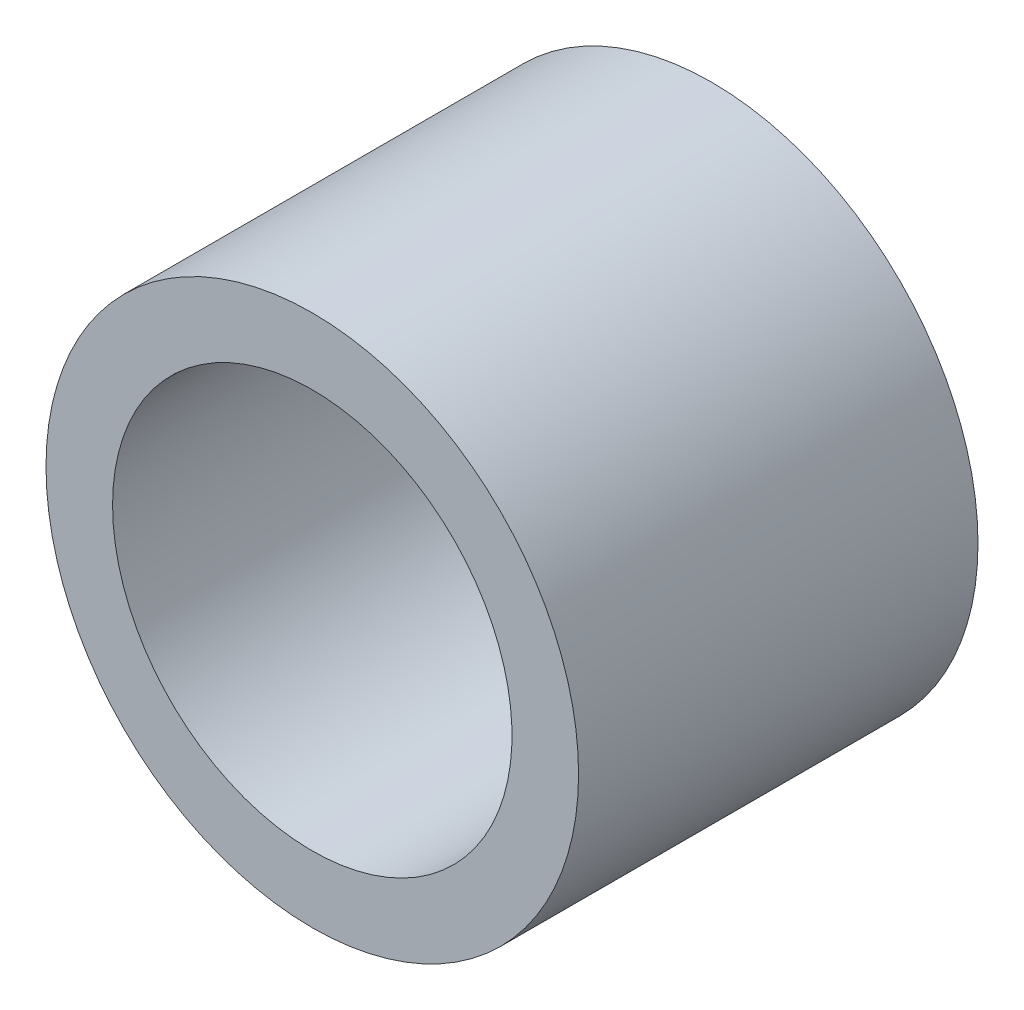
ISO-10303-21;
HEADER;
FILE_DESCRIPTION(('STEP AP214'),'2;1');
FILE_NAME('part.step','',(''),(''),'','','');
FILE_SCHEMA(('AUTOMOTIVE_DESIGN { 1 0 10303 214 1 1 1 1 }'));
ENDSEC;
DATA;
#1=APPLICATION_CONTEXT('core data for automotive mechanical design processes');
#2=APPLICATION_PROTOCOL_DEFINITION('international standard','automotive_design',2000,#1);
#3=PRODUCT_CONTEXT('',#1,'mechanical');
#4=PRODUCT('Part','Part','',(#3));
#5=PRODUCT_RELATED_PRODUCT_CATEGORY('part','',(#4));
#6=PRODUCT_DEFINITION_FORMATION('','',#4);
#7=PRODUCT_DEFINITION_CONTEXT('part definition',#1,'design');
#8=PRODUCT_DEFINITION('design','',#6,#7);
#9=PRODUCT_DEFINITION_SHAPE('','',#8);
#10=(LENGTH_UNIT() NAMED_UNIT(*) SI_UNIT(.MILLI.,.METRE.));
#11=(NAMED_UNIT(*) PLANE_ANGLE_UNIT() SI_UNIT($,.RADIAN.));
#12=(NAMED_UNIT(*) SI_UNIT($,.STERADIAN.) SOLID_ANGLE_UNIT());
#13=UNCERTAINTY_MEASURE_WITH_UNIT(LENGTH_MEASURE(1.E-05),#10,'distance_accuracy_value','');
#14=(GEOMETRIC_REPRESENTATION_CONTEXT(3) GLOBAL_UNCERTAINTY_ASSIGNED_CONTEXT((#13)) GLOBAL_UNIT_ASSIGNED_CONTEXT((#10,
#11,#12)) REPRESENTATION_CONTEXT('',''));
#15=CARTESIAN_POINT('',(0.,0.,0.));
#16=DIRECTION('',(0.,0.,1.));
#17=DIRECTION('',(1.,0.,0.));
#18=AXIS2_PLACEMENT_3D('',#15,#16,#17);
#19=CARTESIAN_POINT('',(0.,0.,19.05));
#20=DIRECTION('',(0.,0.,1.));
#21=DIRECTION('',(1.,0.,0.));
#22=AXIS2_PLACEMENT_3D('',#19,#20,#21);
#23=PLANE('',#22);
#24=CARTESIAN_POINT('',(0.,0.,19.05));
#25=DIRECTION('',(0.,0.,1.));
#26=DIRECTION('',(1.,0.,0.));
#27=AXIS2_PLACEMENT_3D('',#24,#25,#26);
#28=CIRCLE('',#27,12.7);
#29=CARTESIAN_POINT('',(-12.7,0.,19.05));
#30=VERTEX_POINT('',#29);
#31=EDGE_CURVE('E10',#30,#30,#28,.T.);
#32=ORIENTED_EDGE('',*,*,#31,.T.);
#33=EDGE_LOOP('',(#32));
#34=FACE_BOUND('',#33,.T.);
#35=CARTESIAN_POINT('',(0.,0.,19.05));
#36=DIRECTION('',(0.,0.,1.));
#37=DIRECTION('',(1.,0.,0.));
#38=AXIS2_PLACEMENT_3D('',#35,#36,#37);
#39=CIRCLE('',#38,9.525);
#40=CARTESIAN_POINT('',(-9.525,0.,19.05));
#41=VERTEX_POINT('',#40);
#42=EDGE_CURVE('E43',#41,#41,#39,.T.);
#43=ORIENTED_EDGE('',*,*,#42,.F.);
#44=EDGE_LOOP('',(#43));
#45=FACE_BOUND('',#44,.T.);
#46=ADVANCED_FACE('F32',(#34,#45),#23,.T.);
#47=CARTESIAN_POINT('',(0.,0.,0.));
#48=DIRECTION('',(0.,0.,1.));
#49=DIRECTION('',(1.,0.,0.));
#50=AXIS2_PLACEMENT_3D('',#47,#48,#49);
#51=PLANE('',#50);
#52=CARTESIAN_POINT('',(0.,0.,0.));
#53=DIRECTION('',(0.,0.,1.));
#54=DIRECTION('',(1.,0.,0.));
#55=AXIS2_PLACEMENT_3D('',#52,#53,#54);
#56=CIRCLE('',#55,12.7);
#57=CARTESIAN_POINT('',(-12.7,0.,0.));
#58=VERTEX_POINT('',#57);
#59=EDGE_CURVE('E36',#58,#58,#56,.T.);
#60=ORIENTED_EDGE('',*,*,#59,.F.);
#61=EDGE_LOOP('',(#60));
#62=FACE_BOUND('',#61,.T.);
#63=CARTESIAN_POINT('',(0.,0.,0.));
#64=DIRECTION('',(0.,0.,1.));
#65=DIRECTION('',(1.,0.,0.));
#66=AXIS2_PLACEMENT_3D('',#63,#64,#65);
#67=CIRCLE('',#66,9.525);
#68=CARTESIAN_POINT('',(-9.525,0.,0.));
#69=VERTEX_POINT('',#68);
#70=EDGE_CURVE('E45',#69,#69,#67,.T.);
#71=ORIENTED_EDGE('',*,*,#70,.T.);
#72=EDGE_LOOP('',(#71));
#73=FACE_BOUND('',#72,.T.);
#74=ADVANCED_FACE('F55',(#62,#73),#51,.F.);
#75=CARTESIAN_POINT('',(0.,0.,19.05));
#76=DIRECTION('',(0.,0.,-1.));
#77=DIRECTION('',(-1.,0.,0.));
#78=AXIS2_PLACEMENT_3D('',#75,#76,#77);
#79=CYLINDRICAL_SURFACE('',#78,12.7);
#80=CARTESIAN_POINT('',(-12.7,0.,19.05));
#81=CARTESIAN_POINT('',(-12.7,0.,18.8515625));
#82=CARTESIAN_POINT('',(-12.7,0.,18.653125));
#83=CARTESIAN_POINT('',(-12.7,0.,18.25625));
#84=CARTESIAN_POINT('',(-12.7,0.,18.0578125));
#85=CARTESIAN_POINT('',(-12.7,0.,17.6609375));
#86=CARTESIAN_POINT('',(-12.7,0.,17.4625));
#87=CARTESIAN_POINT('',(-12.7,0.,17.065625));
#88=CARTESIAN_POINT('',(-12.7,0.,16.8671875));
#89=CARTESIAN_POINT('',(-12.7,0.,16.4703125));
#90=CARTESIAN_POINT('',(-12.7,0.,16.271875));
#91=CARTESIAN_POINT('',(-12.7,0.,15.875));
#92=CARTESIAN_POINT('',(-12.7,0.,15.6765625));
#93=CARTESIAN_POINT('',(-12.7,0.,15.2796875));
#94=CARTESIAN_POINT('',(-12.7,0.,15.08125));
#95=CARTESIAN_POINT('',(-12.7,0.,14.684375));
#96=CARTESIAN_POINT('',(-12.7,0.,14.4859375));
#97=CARTESIAN_POINT('',(-12.7,0.,14.0890625));
#98=CARTESIAN_POINT('',(-12.7,0.,13.890625));
#99=CARTESIAN_POINT('',(-12.7,0.,13.49375));
#100=CARTESIAN_POINT('',(-12.7,0.,13.2953125));
#101=CARTESIAN_POINT('',(-12.7,0.,12.8984375));
#102=CARTESIAN_POINT('',(-12.7,0.,12.7));
#103=CARTESIAN_POINT('',(-12.7,0.,12.303125));
#104=CARTESIAN_POINT('',(-12.7,0.,12.1046875));
#105=CARTESIAN_POINT('',(-12.7,0.,11.7078125));
#106=CARTESIAN_POINT('',(-12.7,0.,11.509375));
#107=CARTESIAN_POINT('',(-12.7,0.,11.1125));
#108=CARTESIAN_POINT('',(-12.7,0.,10.9140625));
#109=CARTESIAN_POINT('',(-12.7,0.,10.5171875));
#110=CARTESIAN_POINT('',(-12.7,0.,10.31875));
#111=CARTESIAN_POINT('',(-12.7,0.,9.921875));
#112=CARTESIAN_POINT('',(-12.7,0.,9.7234375));
#113=CARTESIAN_POINT('',(-12.7,0.,9.3265625));
#114=CARTESIAN_POINT('',(-12.7,0.,9.128125));
#115=CARTESIAN_POINT('',(-12.7,0.,8.73125));
#116=CARTESIAN_POINT('',(-12.7,0.,8.5328125));
#117=CARTESIAN_POINT('',(-12.7,0.,8.1359375));
#118=CARTESIAN_POINT('',(-12.7,0.,7.9375));
#119=CARTESIAN_POINT('',(-12.7,0.,7.540625));
#120=CARTESIAN_POINT('',(-12.7,0.,7.3421875));
#121=CARTESIAN_POINT('',(-12.7,0.,6.9453125));
#122=CARTESIAN_POINT('',(-12.7,0.,6.746875));
#123=CARTESIAN_POINT('',(-12.7,0.,6.35));
#124=CARTESIAN_POINT('',(-12.7,0.,6.1515625));
#125=CARTESIAN_POINT('',(-12.7,0.,5.7546875));
#126=CARTESIAN_POINT('',(-12.7,0.,5.55625));
#127=CARTESIAN_POINT('',(-12.7,0.,5.159375));
#128=CARTESIAN_POINT('',(-12.7,0.,4.9609375));
#129=CARTESIAN_POINT('',(-12.7,0.,4.5640625));
#130=CARTESIAN_POINT('',(-12.7,0.,4.365625));
#131=CARTESIAN_POINT('',(-12.7,0.,3.96875));
#132=CARTESIAN_POINT('',(-12.7,0.,3.7703125));
#133=CARTESIAN_POINT('',(-12.7,0.,3.3734375));
#134=CARTESIAN_POINT('',(-12.7,0.,3.175));
#135=CARTESIAN_POINT('',(-12.7,0.,2.778125));
#136=CARTESIAN_POINT('',(-12.7,0.,2.5796875));
#137=CARTESIAN_POINT('',(-12.7,0.,2.1828125));
#138=CARTESIAN_POINT('',(-12.7,0.,1.984375));
#139=CARTESIAN_POINT('',(-12.7,0.,1.5875));
#140=CARTESIAN_POINT('',(-12.7,0.,1.3890625));
#141=CARTESIAN_POINT('',(-12.7,0.,0.992187500000001));
#142=CARTESIAN_POINT('',(-12.7,0.,0.793750000000001));
#143=CARTESIAN_POINT('',(-12.7,0.,0.396875));
#144=CARTESIAN_POINT('',(-12.7,0.,0.1984375));
#145=CARTESIAN_POINT('',(-12.7,0.,0.));
#146=B_SPLINE_CURVE_WITH_KNOTS('',3,(#80,#81,#82,#83,#84,#85,#86,#87,#88,#89,#90,#91,#92,#93,
#94,#95,#96,#97,#98,#99,#100,#101,#102,#103,#104,#105,#106,#107,#108,#109,#110,#111,#112,#113,
#114,#115,#116,#117,#118,#119,#120,#121,#122,#123,#124,#125,#126,#127,#128,#129,#130,#131,#132,
#133,#134,#135,#136,#137,#138,#139,#140,#141,#142,#143,#144,#145),.UNSPECIFIED.,.F.,.F.,(4,2,2,
2,2,2,2,2,2,2,2,2,2,2,2,2,2,2,2,2,2,2,2,2,2,2,2,2,2,2,2,2,4),(0.,0.595312499999997,1.190625,
1.7859375,2.38125,2.9765625,3.571875,4.1671875,4.7625,5.3578125,5.953125,6.5484375,7.14375,
7.7390625,8.334375,8.9296875,9.525,10.1203125,10.715625,11.3109375,11.90625,12.5015625,
13.096875,13.6921875,14.2875,14.8828125,15.478125,16.0734375,16.66875,17.2640625,17.859375,
18.4546875,19.05),.UNSPECIFIED.);
#147=EDGE_CURVE('BSEAM34',#30,#58,#146,.T.);
#148=ORIENTED_EDGE('',*,*,#31,.F.);
#149=ORIENTED_EDGE('',*,*,#59,.T.);
#150=ORIENTED_EDGE('',*,*,#147,.T.);
#151=ORIENTED_EDGE('',*,*,#147,.F.);
#152=EDGE_LOOP('',(#148,#150,#149,#151));
#153=FACE_BOUND('',#152,.T.);
#154=ADVANCED_FACE('F34',(#153),#79,.T.);
#155=CARTESIAN_POINT('',(0.,0.,19.05));
#156=DIRECTION('',(0.,0.,-1.));
#157=DIRECTION('',(-1.,0.,0.));
#158=AXIS2_PLACEMENT_3D('',#155,#156,#157);
#159=CYLINDRICAL_SURFACE('',#158,9.525);
#160=CARTESIAN_POINT('',(-9.525,0.,19.05));
#161=CARTESIAN_POINT('',(-9.525,0.,18.8515625));
#162=CARTESIAN_POINT('',(-9.525,0.,18.653125));
#163=CARTESIAN_POINT('',(-9.525,0.,18.25625));
#164=CARTESIAN_POINT('',(-9.525,0.,18.0578125));
#165=CARTESIAN_POINT('',(-9.525,0.,17.6609375));
#166=CARTESIAN_POINT('',(-9.525,0.,17.4625));
#167=CARTESIAN_POINT('',(-9.525,0.,17.065625));
#168=CARTESIAN_POINT('',(-9.525,0.,16.8671875));
#169=CARTESIAN_POINT('',(-9.525,0.,16.4703125));
#170=CARTESIAN_POINT('',(-9.525,0.,16.271875));
#171=CARTESIAN_POINT('',(-9.525,0.,15.875));
#172=CARTESIAN_POINT('',(-9.525,0.,15.6765625));
#173=CARTESIAN_POINT('',(-9.525,0.,15.2796875));
#174=CARTESIAN_POINT('',(-9.525,0.,15.08125));
#175=CARTESIAN_POINT('',(-9.525,0.,14.684375));
#176=CARTESIAN_POINT('',(-9.525,0.,14.4859375));
#177=CARTESIAN_POINT('',(-9.525,0.,14.0890625));
#178=CARTESIAN_POINT('',(-9.525,0.,13.890625));
#179=CARTESIAN_POINT('',(-9.525,0.,13.49375));
#180=CARTESIAN_POINT('',(-9.525,0.,13.2953125));
#181=CARTESIAN_POINT('',(-9.525,0.,12.8984375));
#182=CARTESIAN_POINT('',(-9.525,0.,12.7));
#183=CARTESIAN_POINT('',(-9.525,0.,12.303125));
#184=CARTESIAN_POINT('',(-9.525,0.,12.1046875));
#185=CARTESIAN_POINT('',(-9.525,0.,11.7078125));
#186=CARTESIAN_POINT('',(-9.525,0.,11.509375));
#187=CARTESIAN_POINT('',(-9.525,0.,11.1125));
#188=CARTESIAN_POINT('',(-9.525,0.,10.9140625));
#189=CARTESIAN_POINT('',(-9.525,0.,10.5171875));
#190=CARTESIAN_POINT('',(-9.525,0.,10.31875));
#191=CARTESIAN_POINT('',(-9.525,0.,9.921875));
#192=CARTESIAN_POINT('',(-9.525,0.,9.7234375));
#193=CARTESIAN_POINT('',(-9.525,0.,9.3265625));
#194=CARTESIAN_POINT('',(-9.525,0.,9.128125));
#195=CARTESIAN_POINT('',(-9.525,0.,8.73125));
#196=CARTESIAN_POINT('',(-9.525,0.,8.5328125));
#197=CARTESIAN_POINT('',(-9.525,0.,8.1359375));
#198=CARTESIAN_POINT('',(-9.525,0.,7.9375));
#199=CARTESIAN_POINT('',(-9.525,0.,7.540625));
#200=CARTESIAN_POINT('',(-9.525,0.,7.3421875));
#201=CARTESIAN_POINT('',(-9.525,0.,6.9453125));
#202=CARTESIAN_POINT('',(-9.525,0.,6.746875));
#203=CARTESIAN_POINT('',(-9.525,0.,6.35));
#204=CARTESIAN_POINT('',(-9.525,0.,6.1515625));
#205=CARTESIAN_POINT('',(-9.525,0.,5.7546875));
#206=CARTESIAN_POINT('',(-9.525,0.,5.55625));
#207=CARTESIAN_POINT('',(-9.525,0.,5.159375));
#208=CARTESIAN_POINT('',(-9.525,0.,4.9609375));
#209=CARTESIAN_POINT('',(-9.525,0.,4.5640625));
#210=CARTESIAN_POINT('',(-9.525,0.,4.365625));
#211=CARTESIAN_POINT('',(-9.525,0.,3.96875));
#212=CARTESIAN_POINT('',(-9.525,0.,3.7703125));
#213=CARTESIAN_POINT('',(-9.525,0.,3.3734375));
#214=CARTESIAN_POINT('',(-9.525,0.,3.175));
#215=CARTESIAN_POINT('',(-9.525,0.,2.778125));
#216=CARTESIAN_POINT('',(-9.525,0.,2.5796875));
#217=CARTESIAN_POINT('',(-9.525,0.,2.1828125));
#218=CARTESIAN_POINT('',(-9.525,0.,1.984375));
#219=CARTESIAN_POINT('',(-9.525,0.,1.5875));
#220=CARTESIAN_POINT('',(-9.525,0.,1.3890625));
#221=CARTESIAN_POINT('',(-9.525,0.,0.992187500000001));
#222=CARTESIAN_POINT('',(-9.525,0.,0.793750000000001));
#223=CARTESIAN_POINT('',(-9.525,0.,0.396875));
#224=CARTESIAN_POINT('',(-9.525,0.,0.1984375));
#225=CARTESIAN_POINT('',(-9.525,0.,0.));
#226=B_SPLINE_CURVE_WITH_KNOTS('',3,(#160,#161,#162,#163,#164,#165,#166,#167,#168,#169,#170,
#171,#172,#173,#174,#175,#176,#177,#178,#179,#180,#181,#182,#183,#184,#185,#186,#187,#188,#189,
#190,#191,#192,#193,#194,#195,#196,#197,#198,#199,#200,#201,#202,#203,#204,#205,#206,#207,#208,
#209,#210,#211,#212,#213,#214,#215,#216,#217,#218,#219,#220,#221,#222,#223,#224,#225),
.UNSPECIFIED.,.F.,.F.,(4,2,2,2,2,2,2,2,2,2,2,2,2,2,2,2,2,2,2,2,2,2,2,2,2,2,2,2,2,2,2,2,4),(0.,
0.5953125,1.190625,1.7859375,2.38125,2.9765625,3.571875,4.1671875,4.7625,5.3578125,5.953125,
6.5484375,7.14375,7.7390625,8.334375,8.9296875,9.525,10.1203125,10.715625,11.3109375,11.90625,
12.5015625,13.096875,13.6921875,14.2875,14.8828125,15.478125,16.0734375,16.66875,17.2640625,
17.859375,18.4546875,19.05),.UNSPECIFIED.);
#227=EDGE_CURVE('BSEAM51',#41,#69,#226,.T.);
#228=ORIENTED_EDGE('',*,*,#42,.T.);
#229=ORIENTED_EDGE('',*,*,#70,.F.);
#230=ORIENTED_EDGE('',*,*,#227,.T.);
#231=ORIENTED_EDGE('',*,*,#227,.F.);
#232=EDGE_LOOP('',(#228,#230,#229,#231));
#233=FACE_BOUND('',#232,.T.);
#234=ADVANCED_FACE('F51',(#233),#159,.F.);
#235=CLOSED_SHELL('',(#46,#74,#154,#234));
#236=MANIFOLD_SOLID_BREP('B2',#235);
#237=ADVANCED_BREP_SHAPE_REPRESENTATION('',(#18,#236),#14);
#238=SHAPE_DEFINITION_REPRESENTATION(#9,#237);
ENDSEC;
END-ISO-10303-21;
